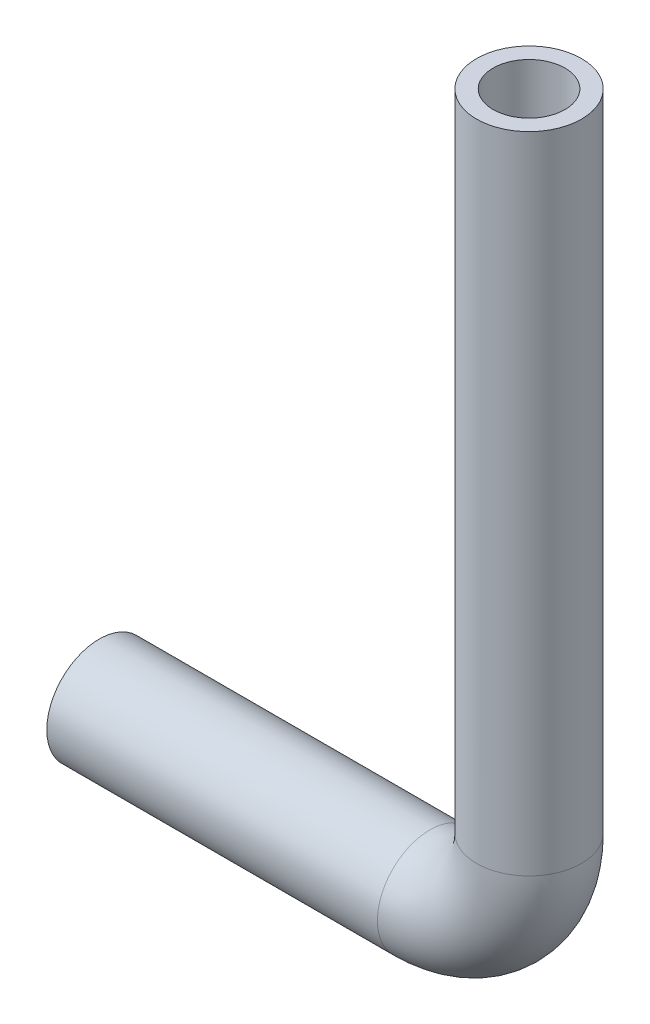
ISO-10303-21;
HEADER;
FILE_DESCRIPTION(('STEP AP214'),'2;1');
FILE_NAME('part.step','',(''),(''),'','','');
FILE_SCHEMA(('AUTOMOTIVE_DESIGN { 1 0 10303 214 1 1 1 1 }'));
ENDSEC;
DATA;
#1=APPLICATION_CONTEXT('core data for automotive mechanical design processes');
#2=APPLICATION_PROTOCOL_DEFINITION('international standard','automotive_design',2000,#1);
#3=PRODUCT_CONTEXT('',#1,'mechanical');
#4=PRODUCT('Part','Part','',(#3));
#5=PRODUCT_RELATED_PRODUCT_CATEGORY('part','',(#4));
#6=PRODUCT_DEFINITION_FORMATION('','',#4);
#7=PRODUCT_DEFINITION_CONTEXT('part definition',#1,'design');
#8=PRODUCT_DEFINITION('design','',#6,#7);
#9=PRODUCT_DEFINITION_SHAPE('','',#8);
#10=(LENGTH_UNIT() NAMED_UNIT(*) SI_UNIT(.MILLI.,.METRE.));
#11=(NAMED_UNIT(*) PLANE_ANGLE_UNIT() SI_UNIT($,.RADIAN.));
#12=(NAMED_UNIT(*) SI_UNIT($,.STERADIAN.) SOLID_ANGLE_UNIT());
#13=UNCERTAINTY_MEASURE_WITH_UNIT(LENGTH_MEASURE(1.E-05),#10,'distance_accuracy_value','');
#14=(GEOMETRIC_REPRESENTATION_CONTEXT(3) GLOBAL_UNCERTAINTY_ASSIGNED_CONTEXT((#13)) GLOBAL_UNIT_ASSIGNED_CONTEXT((#10,
#11,#12)) REPRESENTATION_CONTEXT('',''));
#15=CARTESIAN_POINT('',(0.,0.,0.));
#16=DIRECTION('',(0.,0.,1.));
#17=DIRECTION('',(1.,0.,0.));
#18=AXIS2_PLACEMENT_3D('',#15,#16,#17);
#19=CARTESIAN_POINT('',(154.,167.,50.));
#20=DIRECTION('',(-1.,0.,0.));
#21=DIRECTION('',(0.,0.,-1.));
#22=AXIS2_PLACEMENT_3D('',#19,#20,#21);
#23=PLANE('',#22);
#24=CARTESIAN_POINT('',(154.,167.,50.));
#25=DIRECTION('',(-1.,0.,0.));
#26=DIRECTION('',(0.,0.,-1.));
#27=AXIS2_PLACEMENT_3D('',#24,#25,#26);
#28=CIRCLE('',#27,2.17500000000001);
#29=CARTESIAN_POINT('',(154.,167.,47.825));
#30=VERTEX_POINT('',#29);
#31=EDGE_CURVE('E88',#30,#30,#28,.T.);
#32=ORIENTED_EDGE('',*,*,#31,.F.);
#33=EDGE_LOOP('',(#32));
#34=FACE_BOUND('',#33,.T.);
#35=CARTESIAN_POINT('',(154.,167.,50.));
#36=DIRECTION('',(-1.,0.,0.));
#37=DIRECTION('',(0.,0.,1.));
#38=AXIS2_PLACEMENT_3D('',#35,#36,#37);
#39=CIRCLE('',#38,3.17500000000001);
#40=CARTESIAN_POINT('',(154.,167.,53.175));
#41=VERTEX_POINT('',#40);
#42=EDGE_CURVE('E68',#41,#41,#39,.T.);
#43=ORIENTED_EDGE('',*,*,#42,.T.);
#44=EDGE_LOOP('',(#43));
#45=FACE_BOUND('',#44,.T.);
#46=ADVANCED_FACE('F52',(#34,#45),#23,.T.);
#47=CARTESIAN_POINT('',(180.,212.,50.));
#48=DIRECTION('',(0.,-1.,0.));
#49=DIRECTION('',(0.,0.,-1.));
#50=AXIS2_PLACEMENT_3D('',#47,#48,#49);
#51=PLANE('',#50);
#52=CARTESIAN_POINT('',(180.,212.,50.));
#53=DIRECTION('',(0.,-1.,0.));
#54=DIRECTION('',(0.,0.,-1.));
#55=AXIS2_PLACEMENT_3D('',#52,#53,#54);
#56=CIRCLE('',#55,2.17500000000001);
#57=CARTESIAN_POINT('',(180.,212.,47.825));
#58=VERTEX_POINT('',#57);
#59=EDGE_CURVE('E71',#58,#58,#56,.T.);
#60=ORIENTED_EDGE('',*,*,#59,.T.);
#61=EDGE_LOOP('',(#60));
#62=FACE_BOUND('',#61,.T.);
#63=CARTESIAN_POINT('',(180.,212.,50.));
#64=DIRECTION('',(0.,-1.,0.));
#65=DIRECTION('',(0.,0.,-1.));
#66=AXIS2_PLACEMENT_3D('',#63,#64,#65);
#67=CIRCLE('',#66,3.17500000000001);
#68=CARTESIAN_POINT('',(180.,212.,46.825));
#69=VERTEX_POINT('',#68);
#70=EDGE_CURVE('E11',#69,#69,#67,.T.);
#71=ORIENTED_EDGE('',*,*,#70,.F.);
#72=EDGE_LOOP('',(#71));
#73=FACE_BOUND('',#72,.T.);
#74=ADVANCED_FACE('F91',(#62,#73),#51,.F.);
#75=CARTESIAN_POINT('',(154.,167.,50.));
#76=DIRECTION('',(1.,0.,0.));
#77=DIRECTION('',(0.,0.,-1.));
#78=AXIS2_PLACEMENT_3D('',#75,#76,#77);
#79=CYLINDRICAL_SURFACE('',#78,3.17500000000001);
#80=CARTESIAN_POINT('',(174.,167.,50.));
#81=DIRECTION('',(1.,0.,0.));
#82=DIRECTION('',(0.,0.,-1.));
#83=AXIS2_PLACEMENT_3D('',#80,#81,#82);
#84=CIRCLE('',#83,3.17500000000001);
#85=CARTESIAN_POINT('',(174.,163.825,50.));
#86=VERTEX_POINT('',#85);
#87=EDGE_CURVE('E63',#86,#86,#84,.F.);
#88=ORIENTED_EDGE('',*,*,#87,.T.);
#89=EDGE_LOOP('',(#88));
#90=FACE_BOUND('',#89,.T.);
#91=ORIENTED_EDGE('',*,*,#42,.F.);
#92=EDGE_LOOP('',(#91));
#93=FACE_BOUND('',#92,.T.);
#94=ADVANCED_FACE('F97',(#90,#93),#79,.T.);
#95=CARTESIAN_POINT('',(174.,173.,50.));
#96=DIRECTION('',(0.,0.,1.));
#97=DIRECTION('',(1.,0.,0.));
#98=AXIS2_PLACEMENT_3D('',#95,#96,#97);
#99=TOROIDAL_SURFACE('',#98,6.00000000000001,3.17500000000001);
#100=CARTESIAN_POINT('',(180.,173.,50.));
#101=DIRECTION('',(0.,-1.,0.));
#102=DIRECTION('',(0.,0.,-1.));
#103=AXIS2_PLACEMENT_3D('',#100,#101,#102);
#104=CIRCLE('',#103,3.17500000000001);
#105=CARTESIAN_POINT('',(183.175,173.,50.));
#106=VERTEX_POINT('',#105);
#107=EDGE_CURVE('E58',#106,#106,#104,.T.);
#108=CARTESIAN_POINT('',(174.,173.,50.));
#109=DIRECTION('',(0.,0.,1.));
#110=DIRECTION('',(1.,0.,0.));
#111=AXIS2_PLACEMENT_3D('',#108,#109,#110);
#112=CIRCLE('',#111,9.17500000000002);
#113=EDGE_CURVE('',#86,#106,#112,.T.);
#114=ORIENTED_EDGE('',*,*,#87,.F.);
#115=ORIENTED_EDGE('',*,*,#107,.T.);
#116=ORIENTED_EDGE('',*,*,#113,.T.);
#117=ORIENTED_EDGE('',*,*,#113,.F.);
#118=EDGE_LOOP('',(#114,#116,#115,#117));
#119=FACE_BOUND('',#118,.T.);
#120=ADVANCED_FACE('F110',(#119),#99,.T.);
#121=CARTESIAN_POINT('',(180.,173.,50.));
#122=DIRECTION('',(0.,1.,0.));
#123=DIRECTION('',(0.,0.,1.));
#124=AXIS2_PLACEMENT_3D('',#121,#122,#123);
#125=CYLINDRICAL_SURFACE('',#124,3.17500000000001);
#126=ORIENTED_EDGE('',*,*,#70,.T.);
#127=EDGE_LOOP('',(#126));
#128=FACE_BOUND('',#127,.T.);
#129=ORIENTED_EDGE('',*,*,#107,.F.);
#130=EDGE_LOOP('',(#129));
#131=FACE_BOUND('',#130,.T.);
#132=ADVANCED_FACE('F54',(#128,#131),#125,.T.);
#133=CARTESIAN_POINT('',(154.,167.,50.));
#134=DIRECTION('',(1.,0.,0.));
#135=DIRECTION('',(0.,0.,-1.));
#136=AXIS2_PLACEMENT_3D('',#133,#134,#135);
#137=CYLINDRICAL_SURFACE('',#136,2.17500000000001);
#138=CARTESIAN_POINT('',(174.,167.,50.));
#139=DIRECTION('',(-1.,0.,0.));
#140=DIRECTION('',(0.,0.,-1.));
#141=AXIS2_PLACEMENT_3D('',#138,#139,#140);
#142=CIRCLE('',#141,2.17500000000001);
#143=CARTESIAN_POINT('',(174.,164.825,50.));
#144=VERTEX_POINT('',#143);
#145=EDGE_CURVE('E81',#144,#144,#142,.T.);
#146=ORIENTED_EDGE('',*,*,#145,.F.);
#147=EDGE_LOOP('',(#146));
#148=FACE_BOUND('',#147,.T.);
#149=ORIENTED_EDGE('',*,*,#31,.T.);
#150=EDGE_LOOP('',(#149));
#151=FACE_BOUND('',#150,.T.);
#152=ADVANCED_FACE('F89',(#148,#151),#137,.F.);
#153=CARTESIAN_POINT('',(174.,173.,50.));
#154=DIRECTION('',(0.,0.,1.));
#155=DIRECTION('',(1.,0.,0.));
#156=AXIS2_PLACEMENT_3D('',#153,#154,#155);
#157=TOROIDAL_SURFACE('',#156,6.00000000000001,2.17500000000001);
#158=CARTESIAN_POINT('',(180.,173.,50.));
#159=DIRECTION('',(0.,-1.,0.));
#160=DIRECTION('',(0.,0.,-1.));
#161=AXIS2_PLACEMENT_3D('',#158,#159,#160);
#162=CIRCLE('',#161,2.17500000000001);
#163=CARTESIAN_POINT('',(182.175,173.,50.));
#164=VERTEX_POINT('',#163);
#165=EDGE_CURVE('E76',#164,#164,#162,.T.);
#166=CARTESIAN_POINT('',(174.,173.,50.));
#167=DIRECTION('',(0.,0.,1.));
#168=DIRECTION('',(1.,0.,0.));
#169=AXIS2_PLACEMENT_3D('',#166,#167,#168);
#170=CIRCLE('',#169,8.17500000000001);
#171=EDGE_CURVE('',#144,#164,#170,.T.);
#172=ORIENTED_EDGE('',*,*,#145,.T.);
#173=ORIENTED_EDGE('',*,*,#165,.F.);
#174=ORIENTED_EDGE('',*,*,#171,.T.);
#175=ORIENTED_EDGE('',*,*,#171,.F.);
#176=EDGE_LOOP('',(#172,#174,#173,#175));
#177=FACE_BOUND('',#176,.T.);
#178=ADVANCED_FACE('F103',(#177),#157,.F.);
#179=CARTESIAN_POINT('',(180.,173.,50.));
#180=DIRECTION('',(0.,1.,0.));
#181=DIRECTION('',(0.,0.,1.));
#182=AXIS2_PLACEMENT_3D('',#179,#180,#181);
#183=CYLINDRICAL_SURFACE('',#182,2.17500000000001);
#184=ORIENTED_EDGE('',*,*,#59,.F.);
#185=EDGE_LOOP('',(#184));
#186=FACE_BOUND('',#185,.T.);
#187=ORIENTED_EDGE('',*,*,#165,.T.);
#188=EDGE_LOOP('',(#187));
#189=FACE_BOUND('',#188,.T.);
#190=ADVANCED_FACE('F92',(#186,#189),#183,.F.);
#191=CLOSED_SHELL('',(#46,#74,#94,#120,#132,#152,#178,#190));
#192=MANIFOLD_SOLID_BREP('B2',#191);
#193=ADVANCED_BREP_SHAPE_REPRESENTATION('',(#18,#192),#14);
#194=SHAPE_DEFINITION_REPRESENTATION(#9,#193);
ENDSEC;
END-ISO-10303-21;
